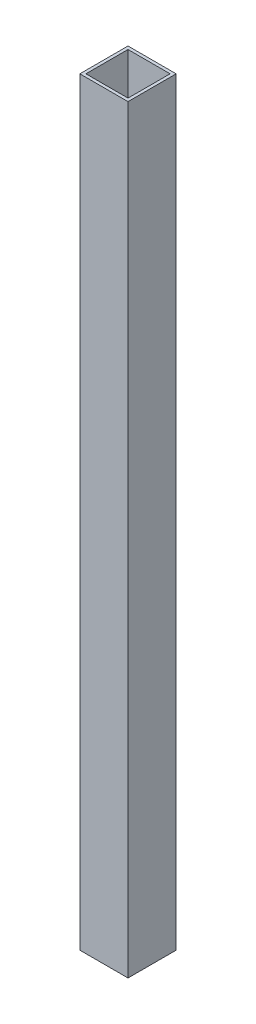
ISO-10303-21;
HEADER;
FILE_DESCRIPTION(('STEP AP214'),'2;1');
FILE_NAME('part.step','',(''),(''),'','','');
FILE_SCHEMA(('AUTOMOTIVE_DESIGN { 1 0 10303 214 1 1 1 1 }'));
ENDSEC;
DATA;
#1=APPLICATION_CONTEXT('core data for automotive mechanical design processes');
#2=APPLICATION_PROTOCOL_DEFINITION('international standard','automotive_design',2000,#1);
#3=PRODUCT_CONTEXT('',#1,'mechanical');
#4=PRODUCT('Part','Part','',(#3));
#5=PRODUCT_RELATED_PRODUCT_CATEGORY('part','',(#4));
#6=PRODUCT_DEFINITION_FORMATION('','',#4);
#7=PRODUCT_DEFINITION_CONTEXT('part definition',#1,'design');
#8=PRODUCT_DEFINITION('design','',#6,#7);
#9=PRODUCT_DEFINITION_SHAPE('','',#8);
#10=(LENGTH_UNIT() NAMED_UNIT(*) SI_UNIT(.MILLI.,.METRE.));
#11=(NAMED_UNIT(*) PLANE_ANGLE_UNIT() SI_UNIT($,.RADIAN.));
#12=(NAMED_UNIT(*) SI_UNIT($,.STERADIAN.) SOLID_ANGLE_UNIT());
#13=UNCERTAINTY_MEASURE_WITH_UNIT(LENGTH_MEASURE(1.E-05),#10,'distance_accuracy_value','');
#14=(GEOMETRIC_REPRESENTATION_CONTEXT(3) GLOBAL_UNCERTAINTY_ASSIGNED_CONTEXT((#13)) GLOBAL_UNIT_ASSIGNED_CONTEXT((#10,
#11,#12)) REPRESENTATION_CONTEXT('',''));
#15=CARTESIAN_POINT('',(0.,0.,0.));
#16=DIRECTION('',(0.,0.,1.));
#17=DIRECTION('',(1.,0.,0.));
#18=AXIS2_PLACEMENT_3D('',#15,#16,#17);
#19=CARTESIAN_POINT('',(0.,800.8112,0.));
#20=DIRECTION('',(0.,-1.,0.));
#21=DIRECTION('',(0.,0.,-1.));
#22=AXIS2_PLACEMENT_3D('',#19,#20,#21);
#23=PLANE('',#22);
#24=DIRECTION('',(0.,0.,-1.));
#25=VECTOR('',#24,1.);
#26=CARTESIAN_POINT('',(25.4,800.8112,25.4));
#27=LINE('',#26,#25);
#28=CARTESIAN_POINT('',(25.4,800.8112,25.4));
#29=VERTEX_POINT('',#28);
#30=CARTESIAN_POINT('',(25.4,800.8112,-25.4));
#31=VERTEX_POINT('',#30);
#32=EDGE_CURVE('E139',#29,#31,#27,.T.);
#33=ORIENTED_EDGE('',*,*,#32,.T.);
#34=DIRECTION('',(-1.,0.,0.));
#35=VECTOR('',#34,1.);
#36=CARTESIAN_POINT('',(-25.4,800.8112,-25.4));
#37=LINE('',#36,#35);
#38=CARTESIAN_POINT('',(-25.4,800.8112,-25.4));
#39=VERTEX_POINT('',#38);
#40=EDGE_CURVE('E142',#31,#39,#37,.T.);
#41=ORIENTED_EDGE('',*,*,#40,.T.);
#42=DIRECTION('',(0.,0.,1.));
#43=VECTOR('',#42,1.);
#44=CARTESIAN_POINT('',(-25.4,800.8112,25.4));
#45=LINE('',#44,#43);
#46=CARTESIAN_POINT('',(-25.4,800.8112,25.4));
#47=VERTEX_POINT('',#46);
#48=EDGE_CURVE('E147',#39,#47,#45,.T.);
#49=ORIENTED_EDGE('',*,*,#48,.T.);
#50=DIRECTION('',(1.,0.,0.));
#51=VECTOR('',#50,1.);
#52=CARTESIAN_POINT('',(-25.4,800.8112,25.4));
#53=LINE('',#52,#51);
#54=EDGE_CURVE('E149',#47,#29,#53,.T.);
#55=ORIENTED_EDGE('',*,*,#54,.T.);
#56=EDGE_LOOP('',(#33,#41,#49,#55));
#57=FACE_BOUND('',#56,.T.);
#58=DIRECTION('',(0.,0.,1.));
#59=VECTOR('',#58,1.);
#60=CARTESIAN_POINT('',(-22.225,800.8112,22.225));
#61=LINE('',#60,#59);
#62=CARTESIAN_POINT('',(-22.225,800.8112,-22.225));
#63=VERTEX_POINT('',#62);
#64=CARTESIAN_POINT('',(-22.225,800.8112,22.225));
#65=VERTEX_POINT('',#64);
#66=EDGE_CURVE('E101',#63,#65,#61,.T.);
#67=ORIENTED_EDGE('',*,*,#66,.F.);
#68=DIRECTION('',(-1.,0.,0.));
#69=VECTOR('',#68,1.);
#70=CARTESIAN_POINT('',(22.225,800.8112,-22.225));
#71=LINE('',#70,#69);
#72=CARTESIAN_POINT('',(22.225,800.8112,-22.225));
#73=VERTEX_POINT('',#72);
#74=EDGE_CURVE('E128',#73,#63,#71,.T.);
#75=ORIENTED_EDGE('',*,*,#74,.F.);
#76=DIRECTION('',(0.,0.,-1.));
#77=VECTOR('',#76,1.);
#78=CARTESIAN_POINT('',(22.225,800.8112,22.225));
#79=LINE('',#78,#77);
#80=CARTESIAN_POINT('',(22.225,800.8112,22.225));
#81=VERTEX_POINT('',#80);
#82=EDGE_CURVE('E125',#81,#73,#79,.T.);
#83=ORIENTED_EDGE('',*,*,#82,.F.);
#84=DIRECTION('',(1.,0.,0.));
#85=VECTOR('',#84,1.);
#86=CARTESIAN_POINT('',(22.225,800.8112,22.225));
#87=LINE('',#86,#85);
#88=EDGE_CURVE('E115',#65,#81,#87,.T.);
#89=ORIENTED_EDGE('',*,*,#88,.F.);
#90=EDGE_LOOP('',(#67,#75,#83,#89));
#91=FACE_BOUND('',#90,.T.);
#92=ADVANCED_FACE('F39',(#57,#91),#23,.F.);
#93=CARTESIAN_POINT('',(0.,0.,0.));
#94=DIRECTION('',(0.,-1.,0.));
#95=DIRECTION('',(0.,0.,-1.));
#96=AXIS2_PLACEMENT_3D('',#93,#94,#95);
#97=PLANE('',#96);
#98=DIRECTION('',(0.,0.,-1.));
#99=VECTOR('',#98,1.);
#100=CARTESIAN_POINT('',(25.4,0.,25.4));
#101=LINE('',#100,#99);
#102=CARTESIAN_POINT('',(25.4,0.,25.4));
#103=VERTEX_POINT('',#102);
#104=CARTESIAN_POINT('',(25.4,0.,-25.4));
#105=VERTEX_POINT('',#104);
#106=EDGE_CURVE('E120',#103,#105,#101,.T.);
#107=ORIENTED_EDGE('',*,*,#106,.F.);
#108=DIRECTION('',(1.,0.,0.));
#109=VECTOR('',#108,1.);
#110=CARTESIAN_POINT('',(-25.4,0.,25.4));
#111=LINE('',#110,#109);
#112=CARTESIAN_POINT('',(-25.4,0.,25.4));
#113=VERTEX_POINT('',#112);
#114=EDGE_CURVE('E143',#113,#103,#111,.T.);
#115=ORIENTED_EDGE('',*,*,#114,.F.);
#116=DIRECTION('',(0.,0.,1.));
#117=VECTOR('',#116,1.);
#118=CARTESIAN_POINT('',(-25.4,0.,25.4));
#119=LINE('',#118,#117);
#120=CARTESIAN_POINT('',(-25.4,0.,-25.4));
#121=VERTEX_POINT('',#120);
#122=EDGE_CURVE('E155',#121,#113,#119,.T.);
#123=ORIENTED_EDGE('',*,*,#122,.F.);
#124=DIRECTION('',(-1.,0.,0.));
#125=VECTOR('',#124,1.);
#126=CARTESIAN_POINT('',(-25.4,0.,-25.4));
#127=LINE('',#126,#125);
#128=EDGE_CURVE('E154',#105,#121,#127,.T.);
#129=ORIENTED_EDGE('',*,*,#128,.F.);
#130=EDGE_LOOP('',(#107,#115,#123,#129));
#131=FACE_BOUND('',#130,.T.);
#132=DIRECTION('',(-1.,0.,0.));
#133=VECTOR('',#132,1.);
#134=CARTESIAN_POINT('',(22.225,0.,-22.225));
#135=LINE('',#134,#133);
#136=CARTESIAN_POINT('',(22.225,0.,-22.225));
#137=VERTEX_POINT('',#136);
#138=CARTESIAN_POINT('',(-22.225,0.,-22.225));
#139=VERTEX_POINT('',#138);
#140=EDGE_CURVE('E111',#137,#139,#135,.T.);
#141=ORIENTED_EDGE('',*,*,#140,.T.);
#142=DIRECTION('',(0.,0.,1.));
#143=VECTOR('',#142,1.);
#144=CARTESIAN_POINT('',(-22.225,0.,22.225));
#145=LINE('',#144,#143);
#146=CARTESIAN_POINT('',(-22.225,0.,22.225));
#147=VERTEX_POINT('',#146);
#148=EDGE_CURVE('E62',#139,#147,#145,.T.);
#149=ORIENTED_EDGE('',*,*,#148,.T.);
#150=DIRECTION('',(1.,0.,0.));
#151=VECTOR('',#150,1.);
#152=CARTESIAN_POINT('',(22.225,0.,22.225));
#153=LINE('',#152,#151);
#154=CARTESIAN_POINT('',(22.225,0.,22.225));
#155=VERTEX_POINT('',#154);
#156=EDGE_CURVE('E118',#147,#155,#153,.T.);
#157=ORIENTED_EDGE('',*,*,#156,.T.);
#158=DIRECTION('',(0.,0.,-1.));
#159=VECTOR('',#158,1.);
#160=CARTESIAN_POINT('',(22.225,0.,22.225));
#161=LINE('',#160,#159);
#162=EDGE_CURVE('E135',#155,#137,#161,.T.);
#163=ORIENTED_EDGE('',*,*,#162,.T.);
#164=EDGE_LOOP('',(#141,#149,#157,#163));
#165=FACE_BOUND('',#164,.T.);
#166=ADVANCED_FACE('F171',(#131,#165),#97,.T.);
#167=CARTESIAN_POINT('',(25.4,800.8112,25.4));
#168=DIRECTION('',(-1.,0.,0.));
#169=DIRECTION('',(0.,0.,1.));
#170=AXIS2_PLACEMENT_3D('',#167,#168,#169);
#171=PLANE('',#170);
#172=ORIENTED_EDGE('',*,*,#106,.T.);
#173=DIRECTION('',(0.,-1.,0.));
#174=VECTOR('',#173,1.);
#175=CARTESIAN_POINT('',(25.4,800.8112,-25.4));
#176=LINE('',#175,#174);
#177=EDGE_CURVE('E11',#31,#105,#176,.T.);
#178=ORIENTED_EDGE('',*,*,#177,.F.);
#179=ORIENTED_EDGE('',*,*,#32,.F.);
#180=DIRECTION('',(0.,-1.,0.));
#181=VECTOR('',#180,1.);
#182=CARTESIAN_POINT('',(25.4,800.8112,25.4));
#183=LINE('',#182,#181);
#184=EDGE_CURVE('E148',#29,#103,#183,.T.);
#185=ORIENTED_EDGE('',*,*,#184,.T.);
#186=EDGE_LOOP('',(#172,#178,#179,#185));
#187=FACE_BOUND('',#186,.T.);
#188=ADVANCED_FACE('F41',(#187),#171,.F.);
#189=CARTESIAN_POINT('',(-25.4,800.8112,-25.4));
#190=DIRECTION('',(0.,0.,1.));
#191=DIRECTION('',(1.,0.,0.));
#192=AXIS2_PLACEMENT_3D('',#189,#190,#191);
#193=PLANE('',#192);
#194=ORIENTED_EDGE('',*,*,#128,.T.);
#195=DIRECTION('',(0.,-1.,0.));
#196=VECTOR('',#195,1.);
#197=CARTESIAN_POINT('',(-25.4,800.8112,-25.4));
#198=LINE('',#197,#196);
#199=EDGE_CURVE('E50',#39,#121,#198,.T.);
#200=ORIENTED_EDGE('',*,*,#199,.F.);
#201=ORIENTED_EDGE('',*,*,#40,.F.);
#202=ORIENTED_EDGE('',*,*,#177,.T.);
#203=EDGE_LOOP('',(#194,#200,#201,#202));
#204=FACE_BOUND('',#203,.T.);
#205=ADVANCED_FACE('F183',(#204),#193,.F.);
#206=CARTESIAN_POINT('',(-25.4,800.8112,25.4));
#207=DIRECTION('',(1.,0.,0.));
#208=DIRECTION('',(0.,0.,-1.));
#209=AXIS2_PLACEMENT_3D('',#206,#207,#208);
#210=PLANE('',#209);
#211=ORIENTED_EDGE('',*,*,#122,.T.);
#212=DIRECTION('',(0.,-1.,0.));
#213=VECTOR('',#212,1.);
#214=CARTESIAN_POINT('',(-25.4,800.8112,25.4));
#215=LINE('',#214,#213);
#216=EDGE_CURVE('E158',#47,#113,#215,.T.);
#217=ORIENTED_EDGE('',*,*,#216,.F.);
#218=ORIENTED_EDGE('',*,*,#48,.F.);
#219=ORIENTED_EDGE('',*,*,#199,.T.);
#220=EDGE_LOOP('',(#211,#217,#218,#219));
#221=FACE_BOUND('',#220,.T.);
#222=ADVANCED_FACE('F167',(#221),#210,.F.);
#223=CARTESIAN_POINT('',(-25.4,800.8112,25.4));
#224=DIRECTION('',(0.,0.,-1.));
#225=DIRECTION('',(-1.,0.,0.));
#226=AXIS2_PLACEMENT_3D('',#223,#224,#225);
#227=PLANE('',#226);
#228=ORIENTED_EDGE('',*,*,#114,.T.);
#229=ORIENTED_EDGE('',*,*,#184,.F.);
#230=ORIENTED_EDGE('',*,*,#54,.F.);
#231=ORIENTED_EDGE('',*,*,#216,.T.);
#232=EDGE_LOOP('',(#228,#229,#230,#231));
#233=FACE_BOUND('',#232,.T.);
#234=ADVANCED_FACE('F180',(#233),#227,.F.);
#235=CARTESIAN_POINT('',(-22.225,800.8112,22.225));
#236=DIRECTION('',(1.,0.,0.));
#237=DIRECTION('',(0.,0.,-1.));
#238=AXIS2_PLACEMENT_3D('',#235,#236,#237);
#239=PLANE('',#238);
#240=ORIENTED_EDGE('',*,*,#148,.F.);
#241=DIRECTION('',(0.,-1.,0.));
#242=VECTOR('',#241,1.);
#243=CARTESIAN_POINT('',(-22.225,800.8112,-22.225));
#244=LINE('',#243,#242);
#245=EDGE_CURVE('E109',#63,#139,#244,.T.);
#246=ORIENTED_EDGE('',*,*,#245,.F.);
#247=ORIENTED_EDGE('',*,*,#66,.T.);
#248=DIRECTION('',(0.,-1.,0.));
#249=VECTOR('',#248,1.);
#250=CARTESIAN_POINT('',(-22.225,800.8112,22.225));
#251=LINE('',#250,#249);
#252=EDGE_CURVE('E107',#65,#147,#251,.T.);
#253=ORIENTED_EDGE('',*,*,#252,.T.);
#254=EDGE_LOOP('',(#240,#246,#247,#253));
#255=FACE_BOUND('',#254,.T.);
#256=ADVANCED_FACE('F106',(#255),#239,.T.);
#257=CARTESIAN_POINT('',(22.225,800.8112,22.225));
#258=DIRECTION('',(0.,0.,-1.));
#259=DIRECTION('',(-1.,0.,0.));
#260=AXIS2_PLACEMENT_3D('',#257,#258,#259);
#261=PLANE('',#260);
#262=ORIENTED_EDGE('',*,*,#156,.F.);
#263=ORIENTED_EDGE('',*,*,#252,.F.);
#264=ORIENTED_EDGE('',*,*,#88,.T.);
#265=DIRECTION('',(0.,-1.,0.));
#266=VECTOR('',#265,1.);
#267=CARTESIAN_POINT('',(22.225,800.8112,22.225));
#268=LINE('',#267,#266);
#269=EDGE_CURVE('E123',#81,#155,#268,.T.);
#270=ORIENTED_EDGE('',*,*,#269,.T.);
#271=EDGE_LOOP('',(#262,#263,#264,#270));
#272=FACE_BOUND('',#271,.T.);
#273=ADVANCED_FACE('F116',(#272),#261,.T.);
#274=CARTESIAN_POINT('',(22.225,800.8112,22.225));
#275=DIRECTION('',(-1.,0.,0.));
#276=DIRECTION('',(0.,0.,1.));
#277=AXIS2_PLACEMENT_3D('',#274,#275,#276);
#278=PLANE('',#277);
#279=ORIENTED_EDGE('',*,*,#162,.F.);
#280=ORIENTED_EDGE('',*,*,#269,.F.);
#281=ORIENTED_EDGE('',*,*,#82,.T.);
#282=DIRECTION('',(0.,-1.,0.));
#283=VECTOR('',#282,1.);
#284=CARTESIAN_POINT('',(22.225,800.8112,-22.225));
#285=LINE('',#284,#283);
#286=EDGE_CURVE('E53',#73,#137,#285,.T.);
#287=ORIENTED_EDGE('',*,*,#286,.T.);
#288=EDGE_LOOP('',(#279,#280,#281,#287));
#289=FACE_BOUND('',#288,.T.);
#290=ADVANCED_FACE('F206',(#289),#278,.T.);
#291=CARTESIAN_POINT('',(22.225,800.8112,-22.225));
#292=DIRECTION('',(0.,0.,1.));
#293=DIRECTION('',(1.,0.,0.));
#294=AXIS2_PLACEMENT_3D('',#291,#292,#293);
#295=PLANE('',#294);
#296=ORIENTED_EDGE('',*,*,#140,.F.);
#297=ORIENTED_EDGE('',*,*,#286,.F.);
#298=ORIENTED_EDGE('',*,*,#74,.T.);
#299=ORIENTED_EDGE('',*,*,#245,.T.);
#300=EDGE_LOOP('',(#296,#297,#298,#299));
#301=FACE_BOUND('',#300,.T.);
#302=ADVANCED_FACE('F210',(#301),#295,.T.);
#303=CLOSED_SHELL('',(#92,#166,#188,#205,#222,#234,#256,#273,#290,#302));
#304=MANIFOLD_SOLID_BREP('B2',#303);
#305=ADVANCED_BREP_SHAPE_REPRESENTATION('',(#18,#304),#14);
#306=SHAPE_DEFINITION_REPRESENTATION(#9,#305);
ENDSEC;
END-ISO-10303-21;
